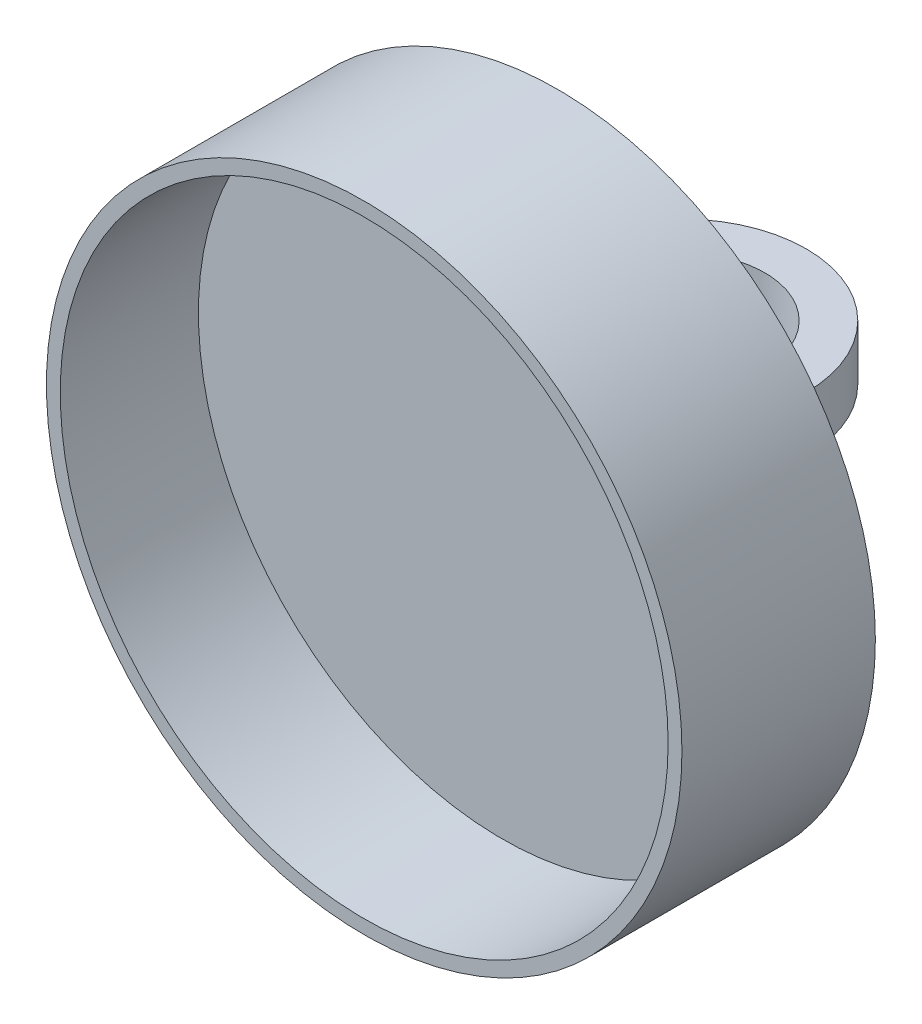
ISO-10303-21;
HEADER;
FILE_DESCRIPTION(('STEP AP214'),'2;1');
FILE_NAME('part.step','',(''),(''),'','','');
FILE_SCHEMA(('AUTOMOTIVE_DESIGN { 1 0 10303 214 1 1 1 1 }'));
ENDSEC;
DATA;
#1=APPLICATION_CONTEXT('core data for automotive mechanical design processes');
#2=APPLICATION_PROTOCOL_DEFINITION('international standard','automotive_design',2000,#1);
#3=PRODUCT_CONTEXT('',#1,'mechanical');
#4=PRODUCT('Part','Part','',(#3));
#5=PRODUCT_RELATED_PRODUCT_CATEGORY('part','',(#4));
#6=PRODUCT_DEFINITION_FORMATION('','',#4);
#7=PRODUCT_DEFINITION_CONTEXT('part definition',#1,'design');
#8=PRODUCT_DEFINITION('design','',#6,#7);
#9=PRODUCT_DEFINITION_SHAPE('','',#8);
#10=(LENGTH_UNIT() NAMED_UNIT(*) SI_UNIT(.MILLI.,.METRE.));
#11=(NAMED_UNIT(*) PLANE_ANGLE_UNIT() SI_UNIT($,.RADIAN.));
#12=(NAMED_UNIT(*) SI_UNIT($,.STERADIAN.) SOLID_ANGLE_UNIT());
#13=UNCERTAINTY_MEASURE_WITH_UNIT(LENGTH_MEASURE(1.E-05),#10,'distance_accuracy_value','');
#14=(GEOMETRIC_REPRESENTATION_CONTEXT(3) GLOBAL_UNCERTAINTY_ASSIGNED_CONTEXT((#13)) GLOBAL_UNIT_ASSIGNED_CONTEXT((#10,
#11,#12)) REPRESENTATION_CONTEXT('',''));
#15=CARTESIAN_POINT('',(0.,0.,0.));
#16=DIRECTION('',(0.,0.,1.));
#17=DIRECTION('',(1.,0.,0.));
#18=AXIS2_PLACEMENT_3D('',#15,#16,#17);
#19=CARTESIAN_POINT('',(0.,2.,-4.5));
#20=DIRECTION('',(0.,1.,0.));
#21=DIRECTION('',(0.,0.,1.));
#22=AXIS2_PLACEMENT_3D('',#19,#20,#21);
#23=PLANE('',#22);
#24=CARTESIAN_POINT('',(0.,2.,-4.5));
#25=DIRECTION('',(0.,1.,0.));
#26=DIRECTION('',(0.,0.,1.));
#27=AXIS2_PLACEMENT_3D('',#24,#25,#26);
#28=CIRCLE('',#27,4.5);
#29=CARTESIAN_POINT('',(0.,2.,0.));
#30=VERTEX_POINT('',#29);
#31=EDGE_CURVE('E11',#30,#30,#28,.T.);
#32=ORIENTED_EDGE('',*,*,#31,.T.);
#33=EDGE_LOOP('',(#32));
#34=FACE_BOUND('',#33,.T.);
#35=CARTESIAN_POINT('',(0.,2.,-4.5));
#36=DIRECTION('',(0.,1.,0.));
#37=DIRECTION('',(0.,0.,1.));
#38=AXIS2_PLACEMENT_3D('',#35,#36,#37);
#39=CIRCLE('',#38,3.);
#40=CARTESIAN_POINT('',(0.,2.,-1.5));
#41=VERTEX_POINT('',#40);
#42=EDGE_CURVE('E50',#41,#41,#39,.T.);
#43=ORIENTED_EDGE('',*,*,#42,.F.);
#44=EDGE_LOOP('',(#43));
#45=FACE_BOUND('',#44,.T.);
#46=ADVANCED_FACE('F39',(#34,#45),#23,.T.);
#47=CARTESIAN_POINT('',(0.,0.,-4.5));
#48=DIRECTION('',(0.,1.,0.));
#49=DIRECTION('',(0.,0.,1.));
#50=AXIS2_PLACEMENT_3D('',#47,#48,#49);
#51=PLANE('',#50);
#52=CARTESIAN_POINT('',(0.,0.,-4.5));
#53=DIRECTION('',(0.,1.,0.));
#54=DIRECTION('',(0.,0.,1.));
#55=AXIS2_PLACEMENT_3D('',#52,#53,#54);
#56=CIRCLE('',#55,4.5);
#57=CARTESIAN_POINT('',(0.,0.,0.));
#58=VERTEX_POINT('',#57);
#59=EDGE_CURVE('E43',#58,#58,#56,.T.);
#60=ORIENTED_EDGE('',*,*,#59,.F.);
#61=EDGE_LOOP('',(#60));
#62=FACE_BOUND('',#61,.T.);
#63=CARTESIAN_POINT('',(0.,0.,-4.5));
#64=DIRECTION('',(0.,1.,0.));
#65=DIRECTION('',(0.,0.,1.));
#66=AXIS2_PLACEMENT_3D('',#63,#64,#65);
#67=CIRCLE('',#66,3.);
#68=CARTESIAN_POINT('',(0.,0.,-1.5));
#69=VERTEX_POINT('',#68);
#70=EDGE_CURVE('E52',#69,#69,#67,.T.);
#71=ORIENTED_EDGE('',*,*,#70,.T.);
#72=EDGE_LOOP('',(#71));
#73=FACE_BOUND('',#72,.T.);
#74=ADVANCED_FACE('F62',(#62,#73),#51,.F.);
#75=CARTESIAN_POINT('',(0.,2.,-4.5));
#76=DIRECTION('',(0.,-1.,0.));
#77=DIRECTION('',(0.,0.,-1.));
#78=AXIS2_PLACEMENT_3D('',#75,#76,#77);
#79=CYLINDRICAL_SURFACE('',#78,4.5);
#80=ORIENTED_EDGE('',*,*,#31,.F.);
#81=EDGE_LOOP('',(#80));
#82=FACE_BOUND('',#81,.T.);
#83=ORIENTED_EDGE('',*,*,#59,.T.);
#84=EDGE_LOOP('',(#83));
#85=FACE_BOUND('',#84,.T.);
#86=ADVANCED_FACE('F41',(#82,#85),#79,.T.);
#87=CARTESIAN_POINT('',(0.,2.,-4.5));
#88=DIRECTION('',(0.,-1.,0.));
#89=DIRECTION('',(0.,0.,-1.));
#90=AXIS2_PLACEMENT_3D('',#87,#88,#89);
#91=CYLINDRICAL_SURFACE('',#90,3.);
#92=ORIENTED_EDGE('',*,*,#42,.T.);
#93=EDGE_LOOP('',(#92));
#94=FACE_BOUND('',#93,.T.);
#95=ORIENTED_EDGE('',*,*,#70,.F.);
#96=EDGE_LOOP('',(#95));
#97=FACE_BOUND('',#96,.T.);
#98=ADVANCED_FACE('F58',(#94,#97),#91,.F.);
#99=CLOSED_SHELL('',(#46,#74,#86,#98));
#100=MANIFOLD_SOLID_BREP('B2',#99);
#101=CARTESIAN_POINT('',(0.,0.,2.));
#102=DIRECTION('',(0.,0.,-1.));
#103=DIRECTION('',(-1.,0.,0.));
#104=AXIS2_PLACEMENT_3D('',#101,#102,#103);
#105=CYLINDRICAL_SURFACE('',#104,11.5);
#106=CARTESIAN_POINT('',(0.,0.,0.));
#107=DIRECTION('',(0.,0.,1.));
#108=DIRECTION('',(1.,0.,0.));
#109=AXIS2_PLACEMENT_3D('',#106,#107,#108);
#110=CIRCLE('',#109,11.5);
#111=CARTESIAN_POINT('',(11.5,0.,0.));
#112=VERTEX_POINT('',#111);
#113=EDGE_CURVE('E107',#112,#112,#110,.T.);
#114=ORIENTED_EDGE('',*,*,#113,.T.);
#115=EDGE_LOOP('',(#114));
#116=FACE_BOUND('',#115,.T.);
#117=CARTESIAN_POINT('',(0.,0.,7.));
#118=DIRECTION('',(0.,0.,1.));
#119=DIRECTION('',(1.,0.,0.));
#120=AXIS2_PLACEMENT_3D('',#117,#118,#119);
#121=CIRCLE('',#120,11.5);
#122=CARTESIAN_POINT('',(11.5,0.,7.));
#123=VERTEX_POINT('',#122);
#124=EDGE_CURVE('E111',#123,#123,#121,.T.);
#125=ORIENTED_EDGE('',*,*,#124,.F.);
#126=EDGE_LOOP('',(#125));
#127=FACE_BOUND('',#126,.T.);
#128=ADVANCED_FACE('F101',(#116,#127),#105,.T.);
#129=CARTESIAN_POINT('',(0.,0.,0.));
#130=DIRECTION('',(0.,0.,1.));
#131=DIRECTION('',(1.,0.,0.));
#132=AXIS2_PLACEMENT_3D('',#129,#130,#131);
#133=PLANE('',#132);
#134=ORIENTED_EDGE('',*,*,#113,.F.);
#135=EDGE_LOOP('',(#134));
#136=FACE_BOUND('',#135,.T.);
#137=ADVANCED_FACE('F125',(#136),#133,.F.);
#138=CARTESIAN_POINT('',(0.,0.,7.));
#139=DIRECTION('',(0.,0.,1.));
#140=DIRECTION('',(1.,0.,0.));
#141=AXIS2_PLACEMENT_3D('',#138,#139,#140);
#142=PLANE('',#141);
#143=ORIENTED_EDGE('',*,*,#124,.T.);
#144=EDGE_LOOP('',(#143));
#145=FACE_BOUND('',#144,.T.);
#146=CARTESIAN_POINT('',(0.,0.,7.));
#147=DIRECTION('',(0.,0.,1.));
#148=DIRECTION('',(1.,0.,0.));
#149=AXIS2_PLACEMENT_3D('',#146,#147,#148);
#150=CIRCLE('',#149,11.);
#151=CARTESIAN_POINT('',(11.,0.,7.));
#152=VERTEX_POINT('',#151);
#153=EDGE_CURVE('E115',#152,#152,#150,.T.);
#154=ORIENTED_EDGE('',*,*,#153,.F.);
#155=EDGE_LOOP('',(#154));
#156=FACE_BOUND('',#155,.T.);
#157=ADVANCED_FACE('F123',(#145,#156),#142,.T.);
#158=CARTESIAN_POINT('',(0.,0.,7.));
#159=DIRECTION('',(0.,0.,-1.));
#160=DIRECTION('',(-1.,0.,0.));
#161=AXIS2_PLACEMENT_3D('',#158,#159,#160);
#162=CYLINDRICAL_SURFACE('',#161,11.);
#163=ORIENTED_EDGE('',*,*,#153,.T.);
#164=EDGE_LOOP('',(#163));
#165=FACE_BOUND('',#164,.T.);
#166=CARTESIAN_POINT('',(0.,0.,2.));
#167=DIRECTION('',(0.,0.,1.));
#168=DIRECTION('',(1.,0.,0.));
#169=AXIS2_PLACEMENT_3D('',#166,#167,#168);
#170=CIRCLE('',#169,11.);
#171=CARTESIAN_POINT('',(11.,0.,2.));
#172=VERTEX_POINT('',#171);
#173=EDGE_CURVE('E38',#172,#172,#170,.F.);
#174=ORIENTED_EDGE('',*,*,#173,.T.);
#175=EDGE_LOOP('',(#174));
#176=FACE_BOUND('',#175,.T.);
#177=ADVANCED_FACE('F121',(#165,#176),#162,.F.);
#178=CARTESIAN_POINT('',(0.,0.,2.));
#179=DIRECTION('',(0.,0.,1.));
#180=DIRECTION('',(1.,0.,0.));
#181=AXIS2_PLACEMENT_3D('',#178,#179,#180);
#182=PLANE('',#181);
#183=ORIENTED_EDGE('',*,*,#173,.F.);
#184=EDGE_LOOP('',(#183));
#185=FACE_BOUND('',#184,.T.);
#186=ADVANCED_FACE('F132',(#185),#182,.T.);
#187=CLOSED_SHELL('',(#128,#137,#157,#177,#186));
#188=MANIFOLD_SOLID_BREP('B6',#187);
#189=ADVANCED_BREP_SHAPE_REPRESENTATION('',(#18,#100,#188),#14);
#190=SHAPE_DEFINITION_REPRESENTATION(#9,#189);
ENDSEC;
END-ISO-10303-21;
